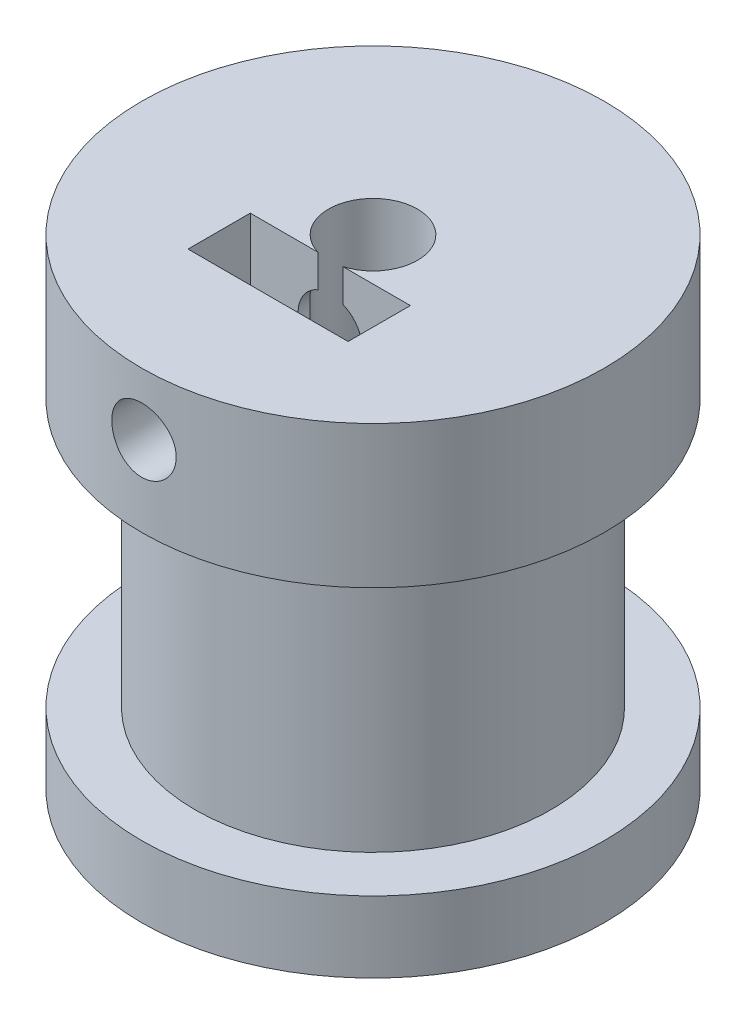
ISO-10303-21;
HEADER;
FILE_DESCRIPTION(('STEP AP214'),'2;1');
FILE_NAME('part.step','',(''),(''),'','','');
FILE_SCHEMA(('AUTOMOTIVE_DESIGN { 1 0 10303 214 1 1 1 1 }'));
ENDSEC;
DATA;
#1=APPLICATION_CONTEXT('core data for automotive mechanical design processes');
#2=APPLICATION_PROTOCOL_DEFINITION('international standard','automotive_design',2000,#1);
#3=PRODUCT_CONTEXT('',#1,'mechanical');
#4=PRODUCT('Part','Part','',(#3));
#5=PRODUCT_RELATED_PRODUCT_CATEGORY('part','',(#4));
#6=PRODUCT_DEFINITION_FORMATION('','',#4);
#7=PRODUCT_DEFINITION_CONTEXT('part definition',#1,'design');
#8=PRODUCT_DEFINITION('design','',#6,#7);
#9=PRODUCT_DEFINITION_SHAPE('','',#8);
#10=(LENGTH_UNIT() NAMED_UNIT(*) SI_UNIT(.MILLI.,.METRE.));
#11=(NAMED_UNIT(*) PLANE_ANGLE_UNIT() SI_UNIT($,.RADIAN.));
#12=(NAMED_UNIT(*) SI_UNIT($,.STERADIAN.) SOLID_ANGLE_UNIT());
#13=UNCERTAINTY_MEASURE_WITH_UNIT(LENGTH_MEASURE(1.E-05),#10,'distance_accuracy_value','');
#14=(GEOMETRIC_REPRESENTATION_CONTEXT(3) GLOBAL_UNCERTAINTY_ASSIGNED_CONTEXT((#13)) GLOBAL_UNIT_ASSIGNED_CONTEXT((#10,
#11,#12)) REPRESENTATION_CONTEXT('',''));
#15=CARTESIAN_POINT('',(0.,0.,0.));
#16=DIRECTION('',(0.,0.,1.));
#17=DIRECTION('',(1.,0.,0.));
#18=AXIS2_PLACEMENT_3D('',#15,#16,#17);
#19=CARTESIAN_POINT('',(0.,7.5,0.));
#20=DIRECTION('',(0.,-1.,0.));
#21=DIRECTION('',(0.,0.,-1.));
#22=AXIS2_PLACEMENT_3D('',#19,#20,#21);
#23=CYLINDRICAL_SURFACE('',#22,2.5);
#24=CARTESIAN_POINT('',(0.,-11.5,0.));
#25=DIRECTION('',(0.,1.,0.));
#26=DIRECTION('',(0.,0.,1.));
#27=AXIS2_PLACEMENT_3D('',#24,#25,#26);
#28=CIRCLE('',#27,2.5);
#29=CARTESIAN_POINT('',(0.,-11.5,2.5));
#30=VERTEX_POINT('',#29);
#31=EDGE_CURVE('E153',#30,#30,#28,.T.);
#32=ORIENTED_EDGE('',*,*,#31,.F.);
#33=EDGE_LOOP('',(#32));
#34=FACE_BOUND('',#33,.T.);
#35=DIRECTION('',(0.,-1.,0.));
#36=VECTOR('',#35,1.);
#37=CARTESIAN_POINT('',(0.700000000000004,7.5,2.4));
#38=LINE('',#37,#36);
#39=CARTESIAN_POINT('',(0.700000000000004,3.5,2.4));
#40=VERTEX_POINT('',#39);
#41=CARTESIAN_POINT('',(0.700000000000004,10.330838533874,2.4));
#42=VERTEX_POINT('',#41);
#43=EDGE_CURVE('E131',#40,#42,#38,.F.);
#44=ORIENTED_EDGE('',*,*,#43,.T.);
#45=CARTESIAN_POINT('',(-1.81,12.,1.72449992751522));
#46=CARTESIAN_POINT('',(-1.80998948059612,11.9143288730232,1.7245204419405));
#47=CARTESIAN_POINT('',(-1.80384482784023,11.8285317752804,1.73103160585297));
#48=CARTESIAN_POINT('',(-1.77987267475267,11.6602254056207,1.75565287363325));
#49=CARTESIAN_POINT('',(-1.76200814763042,11.5777274360209,1.77379973422219));
#50=CARTESIAN_POINT('',(-1.71623638929311,11.4191694694031,1.81810997677912));
#51=CARTESIAN_POINT('',(-1.6884575988404,11.343041839813,1.84417022341141));
#52=CARTESIAN_POINT('',(-1.62397298273087,11.1967514484254,1.9012007384948));
#53=CARTESIAN_POINT('',(-1.58726792405688,11.1265881748438,1.93217058501271));
#54=CARTESIAN_POINT('',(-1.49785505663295,10.979568819626,2.0025610015809));
#55=CARTESIAN_POINT('',(-1.44343025704652,10.9039890197071,2.042466691075));
#56=CARTESIAN_POINT('',(-1.32356077312397,10.7618814530887,2.12211740291106));
#57=CARTESIAN_POINT('',(-1.25810127071293,10.6953660787892,2.16186213462585));
#58=CARTESIAN_POINT('',(-1.1035900045389,10.5610758594207,2.24524936127333));
#59=CARTESIAN_POINT('',(-1.01241337870643,10.4953172552318,2.28826527698072));
#60=CARTESIAN_POINT('',(-0.81660044612472,10.3807255206802,2.36519673544889));
#61=CARTESIAN_POINT('',(-0.711993853951913,10.3318558783463,2.39913187346294));
#62=CARTESIAN_POINT('',(-0.523619175564531,10.2653882982894,2.44589428585896));
#63=CARTESIAN_POINT('',(-0.442389567618134,10.242849068283,2.46198003584047));
#64=CARTESIAN_POINT('',(-0.276440671289564,10.2092384303163,2.48607848484044));
#65=CARTESIAN_POINT('',(-0.191724359412111,10.1981574435662,2.4940979269266));
#66=CARTESIAN_POINT('',(-0.0210021872546535,10.1880983131613,2.50137476904147));
#67=CARTESIAN_POINT('',(0.0650061386660354,10.1891473638563,2.5006124813105));
#68=CARTESIAN_POINT('',(0.235492306453296,10.2033464772782,2.49034941864365));
#69=CARTESIAN_POINT('',(0.319969743700996,10.2164996929484,2.48084636687754));
#70=CARTESIAN_POINT('',(0.482668034157263,10.2536026004375,2.45431093424429));
#71=CARTESIAN_POINT('',(0.560998117000225,10.2772375740567,2.43749829619333));
#72=CARTESIAN_POINT('',(0.712365226742672,10.3341128722536,2.39763828905284));
#73=CARTESIAN_POINT('',(0.78540118143569,10.3673551358108,2.37458966145242));
#74=CARTESIAN_POINT('',(0.932911855227549,10.4464436395051,2.32088350107346));
#75=CARTESIAN_POINT('',(1.00664902389986,10.4932784139117,2.2896658054471));
#76=CARTESIAN_POINT('',(1.1456145351072,10.5960238012534,2.22339984821561));
#77=CARTESIAN_POINT('',(1.21083439860661,10.6519433357497,2.18834783233737));
#78=CARTESIAN_POINT('',(1.34374915456672,10.7831465520978,2.10982338621679));
#79=CARTESIAN_POINT('',(1.40960165849837,10.8600940797695,2.06600735007421));
#80=CARTESIAN_POINT('',(1.52800985494983,11.0245244897631,1.98003251553356));
#81=CARTESIAN_POINT('',(1.58056428995745,11.1120083672856,1.93787387418271));
#82=CARTESIAN_POINT('',(1.66115435121952,11.2767270199455,1.86888673311227));
#83=CARTESIAN_POINT('',(1.6920395433941,11.3520008626258,1.84072398714994));
#84=CARTESIAN_POINT('',(1.74381654993968,11.5081337789155,1.79175352546701));
#85=CARTESIAN_POINT('',(1.76473071641405,11.5889798906383,1.77092938636779));
#86=CARTESIAN_POINT('',(1.79286534464331,11.741623979056,1.74240515907704));
#87=CARTESIAN_POINT('',(1.8017340240046,11.8128175672572,1.73314512533994));
#88=CARTESIAN_POINT('',(1.8108979747469,11.9563360380145,1.72357152944156));
#89=CARTESIAN_POINT('',(1.81120003397197,12.0286599794533,1.72325088407317));
#90=CARTESIAN_POINT('',(1.80322482423073,12.1721706449962,1.73159107493255));
#91=CARTESIAN_POINT('',(1.79496022462363,12.2433588908159,1.74023864793842));
#92=CARTESIAN_POINT('',(1.77044045280055,12.3829940894976,1.7651740220978));
#93=CARTESIAN_POINT('',(1.75417307346165,12.451436681205,1.78147349341129));
#94=CARTESIAN_POINT('',(1.70633648606668,12.6116140140891,1.82754185706526));
#95=CARTESIAN_POINT('',(1.67123349264752,12.7014814872872,1.86009287163159));
#96=CARTESIAN_POINT('',(1.58856425383176,12.8727226872431,1.93117586846755));
#97=CARTESIAN_POINT('',(1.54097320003949,12.9540790510139,1.96971969305805));
#98=CARTESIAN_POINT('',(1.43281945724491,13.1101312325708,2.04980281895501));
#99=CARTESIAN_POINT('',(1.37192081360898,13.1845656952083,2.09139655892829));
#100=CARTESIAN_POINT('',(1.23865959193781,13.3232759986536,2.17297560430337));
#101=CARTESIAN_POINT('',(1.16630700610875,13.387560597275,2.2129622739082));
#102=CARTESIAN_POINT('',(1.01479447758468,13.5015956917407,2.28623960048402));
#103=CARTESIAN_POINT('',(0.93620097649159,13.5519372036557,2.31977323177303));
#104=CARTESIAN_POINT('',(0.770104595132653,13.6406982757917,2.38006945764197));
#105=CARTESIAN_POINT('',(0.682604491554442,13.679121536573,2.40683415346663));
#106=CARTESIAN_POINT('',(0.499721527073782,13.7423555707995,2.45136567177412));
#107=CARTESIAN_POINT('',(0.404280351431465,13.7670531099205,2.4690575558239));
#108=CARTESIAN_POINT('',(0.209284888649135,13.8005704349912,2.49315342029231));
#109=CARTESIAN_POINT('',(0.109735030634368,13.8094068841893,2.49956924689551));
#110=CARTESIAN_POINT('',(-0.0754971600374373,13.8104571680856,2.50033213998664));
#111=CARTESIAN_POINT('',(-0.161170896338388,13.8048238349623,2.49624225540361));
#112=CARTESIAN_POINT('',(-0.330040998234223,13.7816940967662,2.47957032896794));
#113=CARTESIAN_POINT('',(-0.413237225391524,13.7641970300686,2.46698781349259));
#114=CARTESIAN_POINT('',(-0.57358100228955,13.718702844745,2.43466409231777));
#115=CARTESIAN_POINT('',(-0.650808059617503,13.6908917930845,2.41504993662657));
#116=CARTESIAN_POINT('',(-0.799376710571194,13.625938641954,2.3700272973101));
#117=CARTESIAN_POINT('',(-0.870717343874569,13.5887950239341,2.34461787076856));
#118=CARTESIAN_POINT('',(-1.01580527661804,13.5007918770447,2.28583879020753));
#119=CARTESIAN_POINT('',(-1.088590984698,13.4487606727973,2.25185850553675));
#120=CARTESIAN_POINT('',(-1.22493171713315,13.3354829843708,2.18070426797264));
#121=CARTESIAN_POINT('',(-1.28847362352709,13.2742236504651,2.14352589335582));
#122=CARTESIAN_POINT('',(-1.41689402654825,13.1311169776893,2.0613703786706));
#123=CARTESIAN_POINT('',(-1.47978126767867,13.0475638881555,2.01624020191744));
#124=CARTESIAN_POINT('',(-1.59096089883536,12.8694500848855,1.92971247987549));
#125=CARTESIAN_POINT('',(-1.63926432927745,12.7748977734181,1.88831212773237));
#126=CARTESIAN_POINT('',(-1.70762636956347,12.6048588706672,1.82633003586959));
#127=CARTESIAN_POINT('',(-1.73181367073297,12.5319647490134,1.8032085388107));
#128=CARTESIAN_POINT('',(-1.77094563017744,12.3818610253456,1.76479891490647));
#129=CARTESIAN_POINT('',(-1.78592131293388,12.304666874563,1.74948452411498));
#130=CARTESIAN_POINT('',(-1.80050825989217,12.1889192700242,1.73441960512974));
#131=CARTESIAN_POINT('',(-1.80405838471716,12.1513303210167,1.73071876971722));
#132=CARTESIAN_POINT('',(-1.80880689436371,12.0758358663466,1.72575406743727));
#133=CARTESIAN_POINT('',(-1.81000465739094,12.0379302796461,1.72449084489993));
#134=CARTESIAN_POINT('',(-1.81,12.,1.72449992751522));
#135=B_SPLINE_CURVE_WITH_KNOTS('',3,(#45,#46,#47,#48,#49,#50,#51,#52,#53,#54,#55,#56,#57,#58,
#59,#60,#61,#62,#63,#64,#65,#66,#67,#68,#69,#70,#71,#72,#73,#74,#75,#76,#77,#78,#79,#80,#81,#82,
#83,#84,#85,#86,#87,#88,#89,#90,#91,#92,#93,#94,#95,#96,#97,#98,#99,#100,#101,#102,#103,#104,
#105,#106,#107,#108,#109,#110,#111,#112,#113,#114,#115,#116,#117,#118,#119,#120,#121,#122,#123,
#124,#125,#126,#127,#128,#129,#130,#131,#132,#133,#134),.UNSPECIFIED.,.T.,.F.,(4,2,2,2,2,2,2,2,
2,2,2,2,2,2,2,2,2,2,2,2,2,2,2,2,2,2,2,2,2,2,2,2,2,2,2,2,2,2,2,2,2,2,2,2,4),(0.,
0.256820665809797,0.51445664220307,0.768869328898434,1.02326016309553,1.32617610818982,
1.62950211590873,1.98858833647451,2.34689332558117,2.60325916061239,2.8594105068693,
3.11613623036656,3.37292884578234,3.62248441386928,3.87209038341612,4.14935826953201,
4.426900107126,4.75665206434707,5.0864351924296,5.34388230443957,5.60074955017077,
5.81678768153081,6.03265462820851,6.24820278091617,6.46408074647454,6.76788576579325,
7.07229894502431,7.38553418316064,7.69849765146049,7.9948219282511,8.29105410544796,
8.5896951734062,8.88802231278866,9.14460767733247,9.40120735248277,9.65338681672704,
9.90560734099578,10.1916720451814,10.478138827019,10.8184195526693,11.1584420251509,
11.3982649786511,11.6372757278554,11.750951200019,11.8646567157139),.UNSPECIFIED.);
#136=CARTESIAN_POINT('',(0.700000000000004,13.669161466126,2.4));
#137=VERTEX_POINT('',#136);
#138=EDGE_CURVE('E78',#42,#137,#135,.T.);
#139=ORIENTED_EDGE('',*,*,#138,.T.);
#140=CARTESIAN_POINT('',(0.700000000000004,15.5,2.4));
#141=VERTEX_POINT('',#140);
#142=EDGE_CURVE('E128',#137,#141,#38,.F.);
#143=ORIENTED_EDGE('',*,*,#142,.T.);
#144=CARTESIAN_POINT('',(0.,15.5,0.));
#145=DIRECTION('',(0.,1.,0.));
#146=DIRECTION('',(0.,0.,1.));
#147=AXIS2_PLACEMENT_3D('',#144,#145,#146);
#148=CIRCLE('',#147,2.5);
#149=CARTESIAN_POINT('',(-0.700000000000004,15.5,2.4));
#150=VERTEX_POINT('',#149);
#151=EDGE_CURVE('E166',#141,#150,#148,.T.);
#152=ORIENTED_EDGE('',*,*,#151,.T.);
#153=DIRECTION('',(0.,-1.,0.));
#154=VECTOR('',#153,1.);
#155=CARTESIAN_POINT('',(-0.700000000000004,7.5,2.4));
#156=LINE('',#155,#154);
#157=CARTESIAN_POINT('',(-0.700000000000004,13.669161466126,2.4));
#158=VERTEX_POINT('',#157);
#159=EDGE_CURVE('E149',#150,#158,#156,.T.);
#160=ORIENTED_EDGE('',*,*,#159,.T.);
#161=CARTESIAN_POINT('',(-0.700000000000004,10.330838533874,2.4));
#162=VERTEX_POINT('',#161);
#163=EDGE_CURVE('E71',#158,#162,#135,.T.);
#164=ORIENTED_EDGE('',*,*,#163,.T.);
#165=CARTESIAN_POINT('',(-0.700000000000004,3.5,2.4));
#166=VERTEX_POINT('',#165);
#167=EDGE_CURVE('E144',#162,#166,#156,.T.);
#168=ORIENTED_EDGE('',*,*,#167,.T.);
#169=CARTESIAN_POINT('',(0.,3.5,0.));
#170=DIRECTION('',(0.,-1.,0.));
#171=DIRECTION('',(0.,0.,-1.));
#172=AXIS2_PLACEMENT_3D('',#169,#170,#171);
#173=CIRCLE('',#172,2.5);
#174=EDGE_CURVE('E12',#40,#166,#173,.T.);
#175=ORIENTED_EDGE('',*,*,#174,.F.);
#176=EDGE_LOOP('',(#44,#139,#143,#152,#160,#164,#168,#175));
#177=FACE_BOUND('',#176,.T.);
#178=ADVANCED_FACE('F55',(#34,#177),#23,.F.);
#179=CARTESIAN_POINT('',(0.,15.5,0.));
#180=DIRECTION('',(0.,-1.,0.));
#181=DIRECTION('',(0.,0.,-1.));
#182=AXIS2_PLACEMENT_3D('',#179,#180,#181);
#183=CYLINDRICAL_SURFACE('',#182,13.);
#184=CARTESIAN_POINT('',(0.,15.5,0.));
#185=DIRECTION('',(0.,1.,0.));
#186=DIRECTION('',(0.,0.,1.));
#187=AXIS2_PLACEMENT_3D('',#184,#185,#186);
#188=CIRCLE('',#187,13.);
#189=CARTESIAN_POINT('',(0.,15.5,13.));
#190=VERTEX_POINT('',#189);
#191=EDGE_CURVE('E170',#190,#190,#188,.T.);
#192=ORIENTED_EDGE('',*,*,#191,.F.);
#193=EDGE_LOOP('',(#192));
#194=FACE_BOUND('',#193,.T.);
#195=CARTESIAN_POINT('',(0.,7.5,0.));
#196=DIRECTION('',(0.,1.,0.));
#197=DIRECTION('',(0.,0.,1.));
#198=AXIS2_PLACEMENT_3D('',#195,#196,#197);
#199=CIRCLE('',#198,13.);
#200=CARTESIAN_POINT('',(0.,7.5,13.));
#201=VERTEX_POINT('',#200);
#202=EDGE_CURVE('E169',#201,#201,#199,.T.);
#203=ORIENTED_EDGE('',*,*,#202,.T.);
#204=EDGE_LOOP('',(#203));
#205=FACE_BOUND('',#204,.T.);
#206=CARTESIAN_POINT('',(0.,10.19,13.));
#207=CARTESIAN_POINT('',(0.101143783151776,10.1900042314908,12.9999984639502));
#208=CARTESIAN_POINT('',(0.202348303653683,10.1985065603321,12.9988071937559));
#209=CARTESIAN_POINT('',(0.401934247056843,10.2322858763989,12.9941696010116));
#210=CARTESIAN_POINT('',(0.500312727112742,10.2575797324663,12.9907210107969));
#211=CARTESIAN_POINT('',(0.691328832507162,10.324176507444,12.9819567563246));
#212=CARTESIAN_POINT('',(0.783970527733717,10.3654679226162,12.9766424339597));
#213=CARTESIAN_POINT('',(0.960994176675133,10.462860880698,12.9647356747136));
#214=CARTESIAN_POINT('',(1.04537739620689,10.518960149047,12.9581434341683));
#215=CARTESIAN_POINT('',(1.20407578935442,10.6447816237688,12.9443653385829));
#216=CARTESIAN_POINT('',(1.2783269583525,10.7145842005662,12.9371761332682));
#217=CARTESIAN_POINT('',(1.41410174056455,10.8656580220274,12.9230409522782));
#218=CARTESIAN_POINT('',(1.47562466079164,10.9469298907295,12.9160949898632));
#219=CARTESIAN_POINT('',(1.58444103784853,11.1190592263688,12.9032000831672));
#220=CARTESIAN_POINT('',(1.63167342251852,11.2099556538799,12.89725546486));
#221=CARTESIAN_POINT('',(1.71017781810328,11.3984875611946,12.8870814530945));
#222=CARTESIAN_POINT('',(1.74145057806865,11.4961227244776,12.8828519791392));
#223=CARTESIAN_POINT('',(1.7869510757426,11.694691136811,12.8766197103326));
#224=CARTESIAN_POINT('',(1.80128776274631,11.795598966426,12.8746026889051));
#225=CARTESIAN_POINT('',(1.81284648979979,11.9984068475644,12.8729803749246));
#226=CARTESIAN_POINT('',(1.81006937869173,12.1003068496258,12.8733749627561));
#227=CARTESIAN_POINT('',(1.78756855485083,12.3014415878716,12.876518267399));
#228=CARTESIAN_POINT('',(1.76796557826186,12.4006901303816,12.8792502117612));
#229=CARTESIAN_POINT('',(1.71255819866332,12.5944753022461,12.8867342300238));
#230=CARTESIAN_POINT('',(1.67675339578338,12.6890118152412,12.8914863537833));
#231=CARTESIAN_POINT('',(1.58983126452241,12.8710602272965,12.9024940411268));
#232=CARTESIAN_POINT('',(1.53866219714374,12.9585471038694,12.9087546702888));
#233=CARTESIAN_POINT('',(1.42250095856195,13.1237383629745,12.9220701862983));
#234=CARTESIAN_POINT('',(1.35750800422935,13.2014421908955,12.9291251181329));
#235=CARTESIAN_POINT('',(1.21487827149149,13.3455618510785,12.9433086486628));
#236=CARTESIAN_POINT('',(1.13713756696531,13.4118748638605,12.9504373591265));
#237=CARTESIAN_POINT('',(0.971574946302594,13.5305274771508,12.963908697458));
#238=CARTESIAN_POINT('',(0.883752996355493,13.5828670307928,12.9702513226894));
#239=CARTESIAN_POINT('',(0.700436156756636,13.6720899164919,12.9814411985997));
#240=CARTESIAN_POINT('',(0.604937690151535,13.7089659928443,12.9862877470153));
#241=CARTESIAN_POINT('',(0.409021284765083,13.7661292860437,12.9939333297891));
#242=CARTESIAN_POINT('',(0.308603632508069,13.7864174678592,12.9967324832494));
#243=CARTESIAN_POINT('',(0.106587476847225,13.809693910667,12.9999522489985));
#244=CARTESIAN_POINT('',(0.00500557339140205,13.8128236540953,13.0003923128378));
#245=CARTESIAN_POINT('',(-0.197233444792387,13.802068937045,12.9988970706336));
#246=CARTESIAN_POINT('',(-0.297890584012237,13.7881849284829,12.9969618276826));
#247=CARTESIAN_POINT('',(-0.494999246687711,13.7439144305976,12.9909454722018));
#248=CARTESIAN_POINT('',(-0.591466396830795,13.713596207259,12.9868732387198));
#249=CARTESIAN_POINT('',(-0.77794780161843,13.6373894317995,12.9770383455502));
#250=CARTESIAN_POINT('',(-0.867961790118222,13.5915002379393,12.9712756161919));
#251=CARTESIAN_POINT('',(-1.03960826232935,13.485117531864,12.9586525926701));
#252=CARTESIAN_POINT('',(-1.12118412157322,13.4245334678653,12.951785585833));
#253=CARTESIAN_POINT('',(-1.27306066218237,13.2906077652117,12.9377410981619));
#254=CARTESIAN_POINT('',(-1.34336078287239,13.2172654925449,12.9305636019114));
#255=CARTESIAN_POINT('',(-1.47119931261774,13.05927837375,12.9166461477214));
#256=CARTESIAN_POINT('',(-1.52864334832583,12.9745568114897,12.9099096668012));
#257=CARTESIAN_POINT('',(-1.62848492698717,12.7965843611043,12.8976965969324));
#258=CARTESIAN_POINT('',(-1.67088283070945,12.7033336775539,12.8922199777766));
#259=CARTESIAN_POINT('',(-1.73927938766562,12.5112418660916,12.8831712627752));
#260=CARTESIAN_POINT('',(-1.76532930376521,12.4124192832858,12.8795932190185));
#261=CARTESIAN_POINT('',(-1.80045450584698,12.2117488216863,12.8747304149974));
#262=CARTESIAN_POINT('',(-1.80953078899391,12.1099011209689,12.8734455200157));
#263=CARTESIAN_POINT('',(-1.81042980897074,11.9070112904306,12.8733190395733));
#264=CARTESIAN_POINT('',(-1.80240086584733,11.8059697992912,12.8744564501803));
#265=CARTESIAN_POINT('',(-1.76963348742985,11.6066882398289,12.879000999207));
#266=CARTESIAN_POINT('',(-1.74489506494867,11.5084481693578,12.8824081358862));
#267=CARTESIAN_POINT('',(-1.6794607146365,11.3175895241643,12.891101277936));
#268=CARTESIAN_POINT('',(-1.63877370953731,11.224967839532,12.896386232572));
#269=CARTESIAN_POINT('',(-1.54261175749108,11.0478418089924,12.9082409982982));
#270=CARTESIAN_POINT('',(-1.4871364510296,10.9633376604962,12.914810840624));
#271=CARTESIAN_POINT('',(-1.36242841448924,10.8040896584632,12.9285631682638));
#272=CARTESIAN_POINT('',(-1.29308547338856,10.7294325030478,12.9357502798799));
#273=CARTESIAN_POINT('',(-1.14284281822014,10.5927599313934,12.9498876947312));
#274=CARTESIAN_POINT('',(-1.0619404061253,10.5307474747025,12.956837942211));
#275=CARTESIAN_POINT('',(-0.890430642304625,10.4208681092104,12.9697554976556));
#276=CARTESIAN_POINT('',(-0.799779325427055,10.373069283387,12.9757180159711));
#277=CARTESIAN_POINT('',(-0.611698974752102,10.2934446969915,12.9859408117586));
#278=CARTESIAN_POINT('',(-0.514277242761884,10.2616020232193,12.9902028906811));
#279=CARTESIAN_POINT('',(-0.346989245356896,10.2221989600992,12.9955468550792));
#280=CARTESIAN_POINT('',(-0.278166269390331,10.2101422989843,12.9972084093396));
#281=CARTESIAN_POINT('',(-0.139571831403454,10.1940413988184,12.999435506353));
#282=CARTESIAN_POINT('',(-0.0698003788559391,10.1899970798041,13.000001060044));
#283=CARTESIAN_POINT('',(0.,10.19,13.));
#284=B_SPLINE_CURVE_WITH_KNOTS('',3,(#206,#207,#208,#209,#210,#211,#212,#213,#214,#215,#216,
#217,#218,#219,#220,#221,#222,#223,#224,#225,#226,#227,#228,#229,#230,#231,#232,#233,#234,#235,
#236,#237,#238,#239,#240,#241,#242,#243,#244,#245,#246,#247,#248,#249,#250,#251,#252,#253,#254,
#255,#256,#257,#258,#259,#260,#261,#262,#263,#264,#265,#266,#267,#268,#269,#270,#271,#272,#273,
#274,#275,#276,#277,#278,#279,#280,#281,#282,#283),.UNSPECIFIED.,.T.,.F.,(4,2,2,2,2,2,2,2,2,2,2,
2,2,2,2,2,2,2,2,2,2,2,2,2,2,2,2,2,2,2,2,2,2,2,2,2,2,2,4),(0.,0.303176337316983,
0.606657708748602,0.909921252593366,1.21313824071578,1.51818980927883,1.82325798194349,
2.1296120571171,2.43595175251542,2.74030985153063,3.044652854545,3.34683009002426,
3.64901478381801,3.95222871670249,4.25545983137127,4.56129863135928,4.86713845710206,
5.17312162752166,5.47908699669741,5.7825256455334,6.08595623465786,6.38813595767875,
6.69032813619703,6.99443200984677,7.29855100008475,7.60483412730937,7.91110991012581,
8.21642043212447,8.52171301721729,8.8243691788579,9.12702510842108,9.42951195260682,
9.73200615114016,10.0370074250321,10.3420800040941,10.6485911682589,10.9547767458347,
11.1640039839672,11.3732291340007),.UNSPECIFIED.);
#285=CARTESIAN_POINT('',(0.,10.19,13.));
#286=VERTEX_POINT('',#285);
#287=EDGE_CURVE('E201',#286,#286,#284,.T.);
#288=ORIENTED_EDGE('',*,*,#287,.F.);
#289=EDGE_LOOP('',(#288));
#290=FACE_BOUND('',#289,.T.);
#291=ADVANCED_FACE('F216',(#194,#205,#290),#183,.T.);
#292=CARTESIAN_POINT('',(0.,15.5,0.));
#293=DIRECTION('',(0.,1.,0.));
#294=DIRECTION('',(0.,0.,1.));
#295=AXIS2_PLACEMENT_3D('',#292,#293,#294);
#296=PLANE('',#295);
#297=ORIENTED_EDGE('',*,*,#191,.T.);
#298=EDGE_LOOP('',(#297));
#299=FACE_BOUND('',#298,.T.);
#300=DIRECTION('',(0.,0.,1.));
#301=VECTOR('',#300,1.);
#302=CARTESIAN_POINT('',(-4.5,15.5,2.4));
#303=LINE('',#302,#301);
#304=CARTESIAN_POINT('',(-4.5,15.5,2.4));
#305=VERTEX_POINT('',#304);
#306=CARTESIAN_POINT('',(-4.5,15.5,5.9));
#307=VERTEX_POINT('',#306);
#308=EDGE_CURVE('E450',#305,#307,#303,.T.);
#309=ORIENTED_EDGE('',*,*,#308,.F.);
#310=DIRECTION('',(1.,0.,0.));
#311=VECTOR('',#310,1.);
#312=CARTESIAN_POINT('',(-4.5,15.5,2.4));
#313=LINE('',#312,#311);
#314=EDGE_CURVE('E192',#305,#150,#313,.T.);
#315=ORIENTED_EDGE('',*,*,#314,.T.);
#316=ORIENTED_EDGE('',*,*,#151,.F.);
#317=DIRECTION('',(1.,0.,0.));
#318=VECTOR('',#317,1.);
#319=CARTESIAN_POINT('',(0.,15.5,2.4));
#320=LINE('',#319,#318);
#321=CARTESIAN_POINT('',(4.5,15.5,2.4));
#322=VERTEX_POINT('',#321);
#323=EDGE_CURVE('E65',#141,#322,#320,.T.);
#324=ORIENTED_EDGE('',*,*,#323,.T.);
#325=DIRECTION('',(0.,0.,1.));
#326=VECTOR('',#325,1.);
#327=CARTESIAN_POINT('',(4.5,15.5,2.4));
#328=LINE('',#327,#326);
#329=CARTESIAN_POINT('',(4.5,15.5,5.9));
#330=VERTEX_POINT('',#329);
#331=EDGE_CURVE('E190',#322,#330,#328,.T.);
#332=ORIENTED_EDGE('',*,*,#331,.T.);
#333=DIRECTION('',(1.,0.,0.));
#334=VECTOR('',#333,1.);
#335=CARTESIAN_POINT('',(-4.5,15.5,5.9));
#336=LINE('',#335,#334);
#337=EDGE_CURVE('E444',#307,#330,#336,.T.);
#338=ORIENTED_EDGE('',*,*,#337,.F.);
#339=EDGE_LOOP('',(#309,#315,#316,#324,#332,#338));
#340=FACE_BOUND('',#339,.T.);
#341=ADVANCED_FACE('F188',(#299,#340),#296,.T.);
#342=CARTESIAN_POINT('',(0.,7.5,0.));
#343=DIRECTION('',(0.,-1.,0.));
#344=DIRECTION('',(0.,0.,-1.));
#345=AXIS2_PLACEMENT_3D('',#342,#343,#344);
#346=CYLINDRICAL_SURFACE('',#345,10.);
#347=CARTESIAN_POINT('',(0.,7.5,0.));
#348=DIRECTION('',(0.,1.,0.));
#349=DIRECTION('',(0.,0.,1.));
#350=AXIS2_PLACEMENT_3D('',#347,#348,#349);
#351=CIRCLE('',#350,10.);
#352=CARTESIAN_POINT('',(0.,7.5,10.));
#353=VERTEX_POINT('',#352);
#354=EDGE_CURVE('E174',#353,#353,#351,.T.);
#355=ORIENTED_EDGE('',*,*,#354,.F.);
#356=EDGE_LOOP('',(#355));
#357=FACE_BOUND('',#356,.T.);
#358=CARTESIAN_POINT('',(0.,-7.5,0.));
#359=DIRECTION('',(0.,1.,0.));
#360=DIRECTION('',(0.,0.,1.));
#361=AXIS2_PLACEMENT_3D('',#358,#359,#360);
#362=CIRCLE('',#361,10.);
#363=CARTESIAN_POINT('',(0.,-7.5,10.));
#364=VERTEX_POINT('',#363);
#365=EDGE_CURVE('E162',#364,#364,#362,.T.);
#366=ORIENTED_EDGE('',*,*,#365,.T.);
#367=EDGE_LOOP('',(#366));
#368=FACE_BOUND('',#367,.T.);
#369=ADVANCED_FACE('F57',(#357,#368),#346,.T.);
#370=CARTESIAN_POINT('',(0.,7.5,0.));
#371=DIRECTION('',(0.,1.,0.));
#372=DIRECTION('',(0.,0.,1.));
#373=AXIS2_PLACEMENT_3D('',#370,#371,#372);
#374=PLANE('',#373);
#375=ORIENTED_EDGE('',*,*,#354,.T.);
#376=EDGE_LOOP('',(#375));
#377=FACE_BOUND('',#376,.T.);
#378=ORIENTED_EDGE('',*,*,#202,.F.);
#379=EDGE_LOOP('',(#378));
#380=FACE_BOUND('',#379,.T.);
#381=ADVANCED_FACE('F254',(#377,#380),#374,.F.);
#382=CARTESIAN_POINT('',(0.,-11.5,0.));
#383=DIRECTION('',(0.,1.,0.));
#384=DIRECTION('',(0.,0.,1.));
#385=AXIS2_PLACEMENT_3D('',#382,#383,#384);
#386=CYLINDRICAL_SURFACE('',#385,13.);
#387=CARTESIAN_POINT('',(0.,-11.5,0.));
#388=DIRECTION('',(0.,1.,0.));
#389=DIRECTION('',(0.,0.,1.));
#390=AXIS2_PLACEMENT_3D('',#387,#388,#389);
#391=CIRCLE('',#390,13.);
#392=CARTESIAN_POINT('',(0.,-11.5,13.));
#393=VERTEX_POINT('',#392);
#394=EDGE_CURVE('E158',#393,#393,#391,.T.);
#395=ORIENTED_EDGE('',*,*,#394,.T.);
#396=EDGE_LOOP('',(#395));
#397=FACE_BOUND('',#396,.T.);
#398=CARTESIAN_POINT('',(0.,-7.5,0.));
#399=DIRECTION('',(0.,1.,0.));
#400=DIRECTION('',(0.,0.,1.));
#401=AXIS2_PLACEMENT_3D('',#398,#399,#400);
#402=CIRCLE('',#401,13.);
#403=CARTESIAN_POINT('',(0.,-7.5,13.));
#404=VERTEX_POINT('',#403);
#405=EDGE_CURVE('E157',#404,#404,#402,.T.);
#406=ORIENTED_EDGE('',*,*,#405,.F.);
#407=EDGE_LOOP('',(#406));
#408=FACE_BOUND('',#407,.T.);
#409=ADVANCED_FACE('F247',(#397,#408),#386,.T.);
#410=CARTESIAN_POINT('',(0.,-11.5,0.));
#411=DIRECTION('',(0.,1.,0.));
#412=DIRECTION('',(0.,0.,1.));
#413=AXIS2_PLACEMENT_3D('',#410,#411,#412);
#414=PLANE('',#413);
#415=ORIENTED_EDGE('',*,*,#31,.T.);
#416=EDGE_LOOP('',(#415));
#417=FACE_BOUND('',#416,.T.);
#418=ORIENTED_EDGE('',*,*,#394,.F.);
#419=EDGE_LOOP('',(#418));
#420=FACE_BOUND('',#419,.T.);
#421=ADVANCED_FACE('F243',(#417,#420),#414,.F.);
#422=CARTESIAN_POINT('',(0.,-7.5,0.));
#423=DIRECTION('',(0.,1.,0.));
#424=DIRECTION('',(0.,0.,1.));
#425=AXIS2_PLACEMENT_3D('',#422,#423,#424);
#426=PLANE('',#425);
#427=ORIENTED_EDGE('',*,*,#365,.F.);
#428=EDGE_LOOP('',(#427));
#429=FACE_BOUND('',#428,.T.);
#430=ORIENTED_EDGE('',*,*,#405,.T.);
#431=EDGE_LOOP('',(#430));
#432=FACE_BOUND('',#431,.T.);
#433=ADVANCED_FACE('F246',(#429,#432),#426,.T.);
#434=CARTESIAN_POINT('',(-4.5,3.5,2.4));
#435=DIRECTION('',(0.,0.,1.));
#436=DIRECTION('',(1.,0.,0.));
#437=AXIS2_PLACEMENT_3D('',#434,#435,#436);
#438=PLANE('',#437);
#439=ORIENTED_EDGE('',*,*,#167,.F.);
#440=CARTESIAN_POINT('',(0.,12.,2.4));
#441=DIRECTION('',(0.,0.,1.));
#442=DIRECTION('',(1.,0.,0.));
#443=AXIS2_PLACEMENT_3D('',#440,#441,#442);
#444=CIRCLE('',#443,1.81);
#445=EDGE_CURVE('E133',#162,#158,#444,.F.);
#446=ORIENTED_EDGE('',*,*,#445,.T.);
#447=ORIENTED_EDGE('',*,*,#159,.F.);
#448=ORIENTED_EDGE('',*,*,#314,.F.);
#449=DIRECTION('',(0.,1.,0.));
#450=VECTOR('',#449,1.);
#451=CARTESIAN_POINT('',(-4.5,3.5,2.4));
#452=LINE('',#451,#450);
#453=CARTESIAN_POINT('',(-4.5,3.5,2.4));
#454=VERTEX_POINT('',#453);
#455=EDGE_CURVE('E459',#454,#305,#452,.T.);
#456=ORIENTED_EDGE('',*,*,#455,.F.);
#457=DIRECTION('',(1.,0.,0.));
#458=VECTOR('',#457,1.);
#459=CARTESIAN_POINT('',(-4.5,3.5,2.4));
#460=LINE('',#459,#458);
#461=EDGE_CURVE('E214',#454,#166,#460,.T.);
#462=ORIENTED_EDGE('',*,*,#461,.T.);
#463=EDGE_LOOP('',(#439,#446,#447,#448,#456,#462));
#464=FACE_BOUND('',#463,.T.);
#465=ADVANCED_FACE('F195',(#464),#438,.T.);
#466=ORIENTED_EDGE('',*,*,#142,.F.);
#467=CARTESIAN_POINT('',(0.,12.,2.4));
#468=DIRECTION('',(0.,0.,1.));
#469=DIRECTION('',(1.,0.,0.));
#470=AXIS2_PLACEMENT_3D('',#467,#468,#469);
#471=CIRCLE('',#470,1.81);
#472=EDGE_CURVE('E119',#137,#42,#471,.F.);
#473=ORIENTED_EDGE('',*,*,#472,.T.);
#474=ORIENTED_EDGE('',*,*,#43,.F.);
#475=CARTESIAN_POINT('',(4.5,3.5,2.4));
#476=VERTEX_POINT('',#475);
#477=EDGE_CURVE('E454',#40,#476,#460,.T.);
#478=ORIENTED_EDGE('',*,*,#477,.T.);
#479=DIRECTION('',(0.,1.,0.));
#480=VECTOR('',#479,1.);
#481=CARTESIAN_POINT('',(4.5,3.5,2.4));
#482=LINE('',#481,#480);
#483=EDGE_CURVE('E140',#476,#322,#482,.T.);
#484=ORIENTED_EDGE('',*,*,#483,.T.);
#485=ORIENTED_EDGE('',*,*,#323,.F.);
#486=EDGE_LOOP('',(#466,#473,#474,#478,#484,#485));
#487=FACE_BOUND('',#486,.T.);
#488=ADVANCED_FACE('F135',(#487),#438,.T.);
#489=CARTESIAN_POINT('',(4.5,3.5,2.4));
#490=DIRECTION('',(-1.,0.,0.));
#491=DIRECTION('',(0.,0.,1.));
#492=AXIS2_PLACEMENT_3D('',#489,#490,#491);
#493=PLANE('',#492);
#494=ORIENTED_EDGE('',*,*,#331,.F.);
#495=ORIENTED_EDGE('',*,*,#483,.F.);
#496=DIRECTION('',(0.,0.,1.));
#497=VECTOR('',#496,1.);
#498=CARTESIAN_POINT('',(4.5,3.5,2.4));
#499=LINE('',#498,#497);
#500=CARTESIAN_POINT('',(4.5,3.5,5.9));
#501=VERTEX_POINT('',#500);
#502=EDGE_CURVE('E467',#476,#501,#499,.T.);
#503=ORIENTED_EDGE('',*,*,#502,.T.);
#504=DIRECTION('',(0.,1.,0.));
#505=VECTOR('',#504,1.);
#506=CARTESIAN_POINT('',(4.5,3.5,5.9));
#507=LINE('',#506,#505);
#508=EDGE_CURVE('E145',#501,#330,#507,.T.);
#509=ORIENTED_EDGE('',*,*,#508,.T.);
#510=EDGE_LOOP('',(#494,#495,#503,#509));
#511=FACE_BOUND('',#510,.T.);
#512=ADVANCED_FACE('F236',(#511),#493,.T.);
#513=CARTESIAN_POINT('',(-4.5,3.5,5.9));
#514=DIRECTION('',(0.,0.,1.));
#515=DIRECTION('',(1.,0.,0.));
#516=AXIS2_PLACEMENT_3D('',#513,#514,#515);
#517=PLANE('',#516);
#518=CARTESIAN_POINT('',(0.,12.,5.9));
#519=DIRECTION('',(0.,0.,1.));
#520=DIRECTION('',(1.,0.,0.));
#521=AXIS2_PLACEMENT_3D('',#518,#519,#520);
#522=CIRCLE('',#521,1.81);
#523=CARTESIAN_POINT('',(1.81,12.,5.9));
#524=VERTEX_POINT('',#523);
#525=EDGE_CURVE('E59',#524,#524,#522,.F.);
#526=ORIENTED_EDGE('',*,*,#525,.F.);
#527=EDGE_LOOP('',(#526));
#528=FACE_BOUND('',#527,.T.);
#529=ORIENTED_EDGE('',*,*,#337,.T.);
#530=ORIENTED_EDGE('',*,*,#508,.F.);
#531=DIRECTION('',(1.,0.,0.));
#532=VECTOR('',#531,1.);
#533=CARTESIAN_POINT('',(-4.5,3.5,5.9));
#534=LINE('',#533,#532);
#535=CARTESIAN_POINT('',(-4.5,3.5,5.9));
#536=VERTEX_POINT('',#535);
#537=EDGE_CURVE('E470',#536,#501,#534,.T.);
#538=ORIENTED_EDGE('',*,*,#537,.F.);
#539=DIRECTION('',(0.,1.,0.));
#540=VECTOR('',#539,1.);
#541=CARTESIAN_POINT('',(-4.5,3.5,5.9));
#542=LINE('',#541,#540);
#543=EDGE_CURVE('E447',#536,#307,#542,.T.);
#544=ORIENTED_EDGE('',*,*,#543,.T.);
#545=EDGE_LOOP('',(#529,#530,#538,#544));
#546=FACE_BOUND('',#545,.T.);
#547=ADVANCED_FACE('F232',(#528,#546),#517,.F.);
#548=CARTESIAN_POINT('',(-4.5,3.5,2.4));
#549=DIRECTION('',(-1.,0.,0.));
#550=DIRECTION('',(0.,0.,1.));
#551=AXIS2_PLACEMENT_3D('',#548,#549,#550);
#552=PLANE('',#551);
#553=ORIENTED_EDGE('',*,*,#308,.T.);
#554=ORIENTED_EDGE('',*,*,#543,.F.);
#555=DIRECTION('',(0.,0.,1.));
#556=VECTOR('',#555,1.);
#557=CARTESIAN_POINT('',(-4.5,3.5,2.4));
#558=LINE('',#557,#556);
#559=EDGE_CURVE('E462',#454,#536,#558,.T.);
#560=ORIENTED_EDGE('',*,*,#559,.F.);
#561=ORIENTED_EDGE('',*,*,#455,.T.);
#562=EDGE_LOOP('',(#553,#554,#560,#561));
#563=FACE_BOUND('',#562,.T.);
#564=ADVANCED_FACE('F228',(#563),#552,.F.);
#565=CARTESIAN_POINT('',(0.,3.5,0.));
#566=DIRECTION('',(0.,-1.,0.));
#567=DIRECTION('',(0.,0.,-1.));
#568=AXIS2_PLACEMENT_3D('',#565,#566,#567);
#569=PLANE('',#568);
#570=ORIENTED_EDGE('',*,*,#174,.T.);
#571=ORIENTED_EDGE('',*,*,#461,.F.);
#572=ORIENTED_EDGE('',*,*,#559,.T.);
#573=ORIENTED_EDGE('',*,*,#537,.T.);
#574=ORIENTED_EDGE('',*,*,#502,.F.);
#575=ORIENTED_EDGE('',*,*,#477,.F.);
#576=EDGE_LOOP('',(#570,#571,#572,#573,#574,#575));
#577=FACE_BOUND('',#576,.T.);
#578=ADVANCED_FACE('F224',(#577),#569,.F.);
#579=CARTESIAN_POINT('',(0.,12.,13.));
#580=DIRECTION('',(0.,0.,-1.));
#581=DIRECTION('',(-1.,0.,0.));
#582=AXIS2_PLACEMENT_3D('',#579,#580,#581);
#583=CYLINDRICAL_SURFACE('',#582,1.81);
#584=ORIENTED_EDGE('',*,*,#525,.T.);
#585=EDGE_LOOP('',(#584));
#586=FACE_BOUND('',#585,.T.);
#587=ORIENTED_EDGE('',*,*,#287,.T.);
#588=EDGE_LOOP('',(#587));
#589=FACE_BOUND('',#588,.T.);
#590=ADVANCED_FACE('F223',(#586,#589),#583,.F.);
#591=ORIENTED_EDGE('',*,*,#472,.F.);
#592=ORIENTED_EDGE('',*,*,#138,.F.);
#593=EDGE_LOOP('',(#591,#592));
#594=FACE_BOUND('',#593,.T.);
#595=ADVANCED_FACE('F120',(#594),#583,.F.);
#596=ORIENTED_EDGE('',*,*,#445,.F.);
#597=ORIENTED_EDGE('',*,*,#163,.F.);
#598=EDGE_LOOP('',(#596,#597));
#599=FACE_BOUND('',#598,.T.);
#600=ADVANCED_FACE('F222',(#599),#583,.F.);
#601=CLOSED_SHELL('',(#178,#291,#341,#369,#381,#409,#421,#433,#465,#488,#512,#547,#564,#578,
#590,#595,#600));
#602=MANIFOLD_SOLID_BREP('B2',#601);
#603=ADVANCED_BREP_SHAPE_REPRESENTATION('',(#18,#602),#14);
#604=SHAPE_DEFINITION_REPRESENTATION(#9,#603);
ENDSEC;
END-ISO-10303-21;
